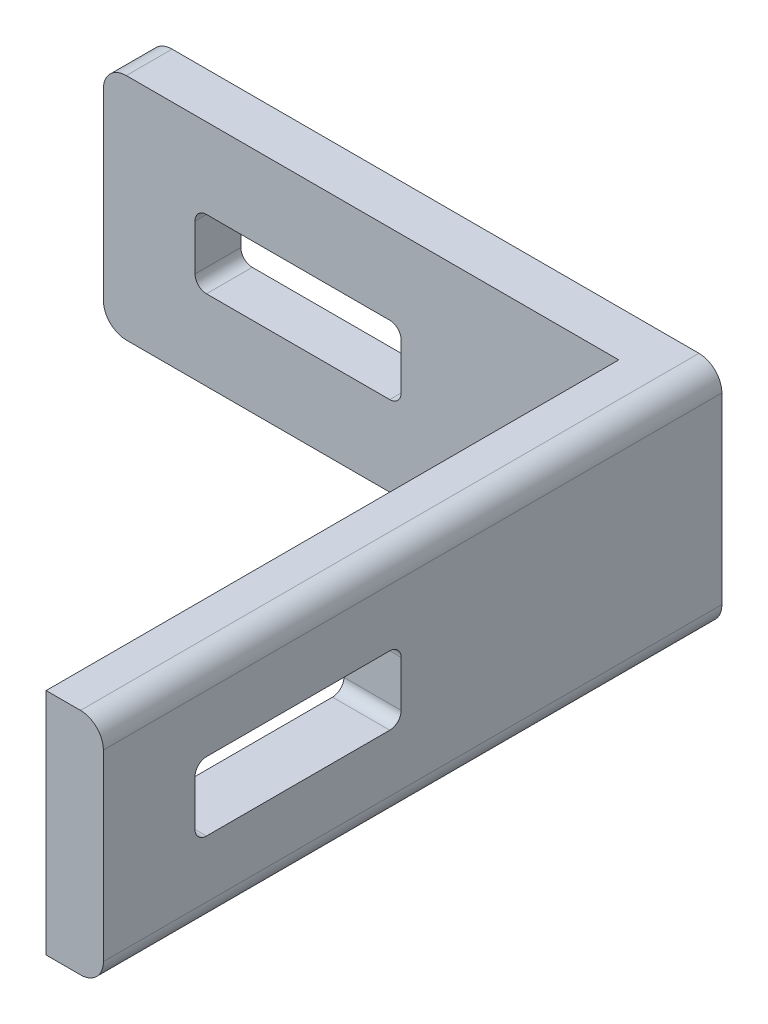
ISO-10303-21;
HEADER;
FILE_DESCRIPTION(('STEP AP214'),'2;1');
FILE_NAME('part.step','',(''),(''),'','','');
FILE_SCHEMA(('AUTOMOTIVE_DESIGN { 1 0 10303 214 1 1 1 1 }'));
ENDSEC;
DATA;
#1=APPLICATION_CONTEXT('core data for automotive mechanical design processes');
#2=APPLICATION_PROTOCOL_DEFINITION('international standard','automotive_design',2000,#1);
#3=PRODUCT_CONTEXT('',#1,'mechanical');
#4=PRODUCT('Part','Part','',(#3));
#5=PRODUCT_RELATED_PRODUCT_CATEGORY('part','',(#4));
#6=PRODUCT_DEFINITION_FORMATION('','',#4);
#7=PRODUCT_DEFINITION_CONTEXT('part definition',#1,'design');
#8=PRODUCT_DEFINITION('design','',#6,#7);
#9=PRODUCT_DEFINITION_SHAPE('','',#8);
#10=(LENGTH_UNIT() NAMED_UNIT(*) SI_UNIT(.MILLI.,.METRE.));
#11=(NAMED_UNIT(*) PLANE_ANGLE_UNIT() SI_UNIT($,.RADIAN.));
#12=(NAMED_UNIT(*) SI_UNIT($,.STERADIAN.) SOLID_ANGLE_UNIT());
#13=UNCERTAINTY_MEASURE_WITH_UNIT(LENGTH_MEASURE(1.E-05),#10,'distance_accuracy_value','');
#14=(GEOMETRIC_REPRESENTATION_CONTEXT(3) GLOBAL_UNCERTAINTY_ASSIGNED_CONTEXT((#13)) GLOBAL_UNIT_ASSIGNED_CONTEXT((#10,
#11,#12)) REPRESENTATION_CONTEXT('',''));
#15=CARTESIAN_POINT('',(0.,0.,0.));
#16=DIRECTION('',(0.,0.,1.));
#17=DIRECTION('',(1.,0.,0.));
#18=AXIS2_PLACEMENT_3D('',#15,#16,#17);
#19=CARTESIAN_POINT('',(34.7267267267267,6.70870870870871,4.));
#20=DIRECTION('',(0.,0.,-1.));
#21=DIRECTION('',(-1.,0.,0.));
#22=AXIS2_PLACEMENT_3D('',#19,#20,#21);
#23=PLANE('',#22);
#24=DIRECTION('',(0.,-1.,0.));
#25=VECTOR('',#24,1.);
#26=CARTESIAN_POINT('',(-5.27327327327327,0.708708708708703,4.));
#27=LINE('',#26,#25);
#28=CARTESIAN_POINT('',(-5.27327327327327,0.708708708708703,4.));
#29=VERTEX_POINT('',#28);
#30=CARTESIAN_POINT('',(-5.27327327327327,-3.29129129129128,4.));
#31=VERTEX_POINT('',#30);
#32=EDGE_CURVE('E279',#29,#31,#27,.T.);
#33=ORIENTED_EDGE('',*,*,#32,.F.);
#34=CARTESIAN_POINT('',(-4.27327327327327,0.708708708708711,4.));
#35=DIRECTION('',(0.,0.,1.));
#36=DIRECTION('',(-1.,0.,0.));
#37=AXIS2_PLACEMENT_3D('',#34,#35,#36);
#38=CIRCLE('',#37,1.);
#39=CARTESIAN_POINT('',(-4.27327327327327,1.70870870870871,4.));
#40=VERTEX_POINT('',#39);
#41=EDGE_CURVE('E277',#40,#29,#38,.T.);
#42=ORIENTED_EDGE('',*,*,#41,.F.);
#43=DIRECTION('',(-1.,0.,0.));
#44=VECTOR('',#43,1.);
#45=CARTESIAN_POINT('',(-4.27327327327327,1.70870870870871,4.));
#46=LINE('',#45,#44);
#47=CARTESIAN_POINT('',(11.7267267267267,1.70870870870871,4.));
#48=VERTEX_POINT('',#47);
#49=EDGE_CURVE('E297',#48,#40,#46,.T.);
#50=ORIENTED_EDGE('',*,*,#49,.F.);
#51=CARTESIAN_POINT('',(11.7267267267267,0.708708708708711,4.));
#52=DIRECTION('',(0.,0.,1.));
#53=DIRECTION('',(1.,0.,0.));
#54=AXIS2_PLACEMENT_3D('',#51,#52,#53);
#55=CIRCLE('',#54,1.);
#56=CARTESIAN_POINT('',(12.7267267267267,0.708708708708703,4.));
#57=VERTEX_POINT('',#56);
#58=EDGE_CURVE('E294',#57,#48,#55,.T.);
#59=ORIENTED_EDGE('',*,*,#58,.F.);
#60=DIRECTION('',(0.,1.,0.));
#61=VECTOR('',#60,1.);
#62=CARTESIAN_POINT('',(12.7267267267267,0.708708708708703,4.));
#63=LINE('',#62,#61);
#64=CARTESIAN_POINT('',(12.7267267267267,-3.29129129129129,4.));
#65=VERTEX_POINT('',#64);
#66=EDGE_CURVE('E291',#65,#57,#63,.T.);
#67=ORIENTED_EDGE('',*,*,#66,.F.);
#68=CARTESIAN_POINT('',(11.7267267267267,-3.29129129129129,4.));
#69=DIRECTION('',(0.,0.,1.));
#70=DIRECTION('',(1.,0.,0.));
#71=AXIS2_PLACEMENT_3D('',#68,#69,#70);
#72=CIRCLE('',#71,1.);
#73=CARTESIAN_POINT('',(11.7267267267267,-4.29129129129129,4.));
#74=VERTEX_POINT('',#73);
#75=EDGE_CURVE('E288',#74,#65,#72,.T.);
#76=ORIENTED_EDGE('',*,*,#75,.F.);
#77=DIRECTION('',(1.,0.,0.));
#78=VECTOR('',#77,1.);
#79=CARTESIAN_POINT('',(-4.27327327327327,-4.29129129129129,4.));
#80=LINE('',#79,#78);
#81=CARTESIAN_POINT('',(-4.27327327327327,-4.29129129129129,4.));
#82=VERTEX_POINT('',#81);
#83=EDGE_CURVE('E285',#82,#74,#80,.T.);
#84=ORIENTED_EDGE('',*,*,#83,.F.);
#85=CARTESIAN_POINT('',(-4.27327327327327,-3.29129129129129,4.));
#86=DIRECTION('',(0.,0.,1.));
#87=DIRECTION('',(1.,0.,0.));
#88=AXIS2_PLACEMENT_3D('',#85,#86,#87);
#89=CIRCLE('',#88,1.);
#90=EDGE_CURVE('E282',#31,#82,#89,.T.);
#91=ORIENTED_EDGE('',*,*,#90,.F.);
#92=EDGE_LOOP('',(#33,#42,#50,#59,#67,#76,#84,#91));
#93=FACE_BOUND('',#92,.T.);
#94=DIRECTION('',(0.,-1.,0.));
#95=VECTOR('',#94,1.);
#96=CARTESIAN_POINT('',(31.7267267267267,8.70870870870871,4.));
#97=LINE('',#96,#95);
#98=CARTESIAN_POINT('',(31.7267267267267,8.70870870870871,4.));
#99=VERTEX_POINT('',#98);
#100=CARTESIAN_POINT('',(31.7267267267267,-11.2912912912913,4.));
#101=VERTEX_POINT('',#100);
#102=EDGE_CURVE('E303',#99,#101,#97,.T.);
#103=ORIENTED_EDGE('',*,*,#102,.F.);
#104=DIRECTION('',(-1.,0.,0.));
#105=VECTOR('',#104,1.);
#106=CARTESIAN_POINT('',(-11.2732732732733,8.70870870870871,4.));
#107=LINE('',#106,#105);
#108=CARTESIAN_POINT('',(-11.2732732732733,8.70870870870871,4.));
#109=VERTEX_POINT('',#108);
#110=EDGE_CURVE('E344',#99,#109,#107,.T.);
#111=ORIENTED_EDGE('',*,*,#110,.T.);
#112=CARTESIAN_POINT('',(-11.2732732732733,6.70870870870871,4.));
#113=DIRECTION('',(0.,0.,1.));
#114=DIRECTION('',(-1.,0.,0.));
#115=AXIS2_PLACEMENT_3D('',#112,#113,#114);
#116=CIRCLE('',#115,2.);
#117=CARTESIAN_POINT('',(-13.2732732732733,6.7087087087087,4.));
#118=VERTEX_POINT('',#117);
#119=EDGE_CURVE('E346',#109,#118,#116,.T.);
#120=ORIENTED_EDGE('',*,*,#119,.T.);
#121=DIRECTION('',(0.,-1.,0.));
#122=VECTOR('',#121,1.);
#123=CARTESIAN_POINT('',(-13.2732732732733,6.7087087087087,4.));
#124=LINE('',#123,#122);
#125=CARTESIAN_POINT('',(-13.2732732732733,-9.29129129129128,4.));
#126=VERTEX_POINT('',#125);
#127=EDGE_CURVE('E349',#118,#126,#124,.T.);
#128=ORIENTED_EDGE('',*,*,#127,.T.);
#129=CARTESIAN_POINT('',(-11.2732732732733,-9.29129129129129,4.));
#130=DIRECTION('',(0.,0.,1.));
#131=DIRECTION('',(-1.,0.,0.));
#132=AXIS2_PLACEMENT_3D('',#129,#130,#131);
#133=CIRCLE('',#132,2.);
#134=CARTESIAN_POINT('',(-11.2732732732733,-11.2912912912913,4.));
#135=VERTEX_POINT('',#134);
#136=EDGE_CURVE('E351',#126,#135,#133,.T.);
#137=ORIENTED_EDGE('',*,*,#136,.T.);
#138=DIRECTION('',(1.,0.,0.));
#139=VECTOR('',#138,1.);
#140=CARTESIAN_POINT('',(-11.2732732732733,-11.2912912912913,4.));
#141=LINE('',#140,#139);
#142=EDGE_CURVE('E353',#135,#101,#141,.T.);
#143=ORIENTED_EDGE('',*,*,#142,.T.);
#144=EDGE_LOOP('',(#103,#111,#120,#128,#137,#143));
#145=FACE_BOUND('',#144,.T.);
#146=ADVANCED_FACE('F35',(#93,#145),#23,.F.);
#147=CARTESIAN_POINT('',(34.7267267267267,6.70870870870871,4.));
#148=DIRECTION('',(0.,0.,-1.));
#149=DIRECTION('',(-1.,0.,0.));
#150=AXIS2_PLACEMENT_3D('',#147,#148,#149);
#151=CYLINDRICAL_SURFACE('',#150,2.);
#152=CARTESIAN_POINT('',(34.7267267267267,6.70870870870871,0.));
#153=DIRECTION('',(0.,0.,1.));
#154=DIRECTION('',(-1.,0.,0.));
#155=AXIS2_PLACEMENT_3D('',#152,#153,#154);
#156=CIRCLE('',#155,2.);
#157=CARTESIAN_POINT('',(36.7267267267267,6.70870870870871,0.));
#158=VERTEX_POINT('',#157);
#159=CARTESIAN_POINT('',(34.7267267267267,8.70870870870871,0.));
#160=VERTEX_POINT('',#159);
#161=EDGE_CURVE('E343',#158,#160,#156,.T.);
#162=ORIENTED_EDGE('',*,*,#161,.T.);
#163=DIRECTION('',(0.,0.,-1.));
#164=VECTOR('',#163,1.);
#165=CARTESIAN_POINT('',(34.7267267267267,8.70870870870871,4.));
#166=LINE('',#165,#164);
#167=CARTESIAN_POINT('',(34.7267267267267,8.70870870870871,54.));
#168=VERTEX_POINT('',#167);
#169=EDGE_CURVE('E391',#168,#160,#166,.T.);
#170=ORIENTED_EDGE('',*,*,#169,.F.);
#171=CARTESIAN_POINT('',(34.7267267267267,6.70870870870871,54.));
#172=DIRECTION('',(0.,0.,1.));
#173=DIRECTION('',(-1.,0.,0.));
#174=AXIS2_PLACEMENT_3D('',#171,#172,#173);
#175=CIRCLE('',#174,2.);
#176=CARTESIAN_POINT('',(36.7267267267267,6.7087087087087,54.));
#177=VERTEX_POINT('',#176);
#178=EDGE_CURVE('E330',#177,#168,#175,.T.);
#179=ORIENTED_EDGE('',*,*,#178,.F.);
#180=DIRECTION('',(0.,0.,-1.));
#181=VECTOR('',#180,1.);
#182=CARTESIAN_POINT('',(36.7267267267267,6.70870870870871,4.));
#183=LINE('',#182,#181);
#184=EDGE_CURVE('E355',#177,#158,#183,.T.);
#185=ORIENTED_EDGE('',*,*,#184,.T.);
#186=EDGE_LOOP('',(#162,#170,#179,#185));
#187=FACE_BOUND('',#186,.T.);
#188=ADVANCED_FACE('F37',(#187),#151,.T.);
#189=CARTESIAN_POINT('',(-11.2732732732733,8.70870870870871,4.));
#190=DIRECTION('',(0.,-1.,0.));
#191=DIRECTION('',(0.,0.,-1.));
#192=AXIS2_PLACEMENT_3D('',#189,#190,#191);
#193=PLANE('',#192);
#194=DIRECTION('',(-1.,0.,0.));
#195=VECTOR('',#194,1.);
#196=CARTESIAN_POINT('',(-11.2732732732733,8.70870870870871,0.));
#197=LINE('',#196,#195);
#198=CARTESIAN_POINT('',(-11.2732732732733,8.70870870870871,0.));
#199=VERTEX_POINT('',#198);
#200=EDGE_CURVE('E358',#160,#199,#197,.T.);
#201=ORIENTED_EDGE('',*,*,#200,.T.);
#202=DIRECTION('',(0.,0.,-1.));
#203=VECTOR('',#202,1.);
#204=CARTESIAN_POINT('',(-11.2732732732733,8.70870870870871,4.));
#205=LINE('',#204,#203);
#206=EDGE_CURVE('E388',#109,#199,#205,.T.);
#207=ORIENTED_EDGE('',*,*,#206,.F.);
#208=ORIENTED_EDGE('',*,*,#110,.F.);
#209=DIRECTION('',(0.,0.,-1.));
#210=VECTOR('',#209,1.);
#211=CARTESIAN_POINT('',(31.7267267267267,8.70870870870871,54.));
#212=LINE('',#211,#210);
#213=CARTESIAN_POINT('',(31.7267267267267,8.70870870870871,54.));
#214=VERTEX_POINT('',#213);
#215=EDGE_CURVE('E335',#214,#99,#212,.T.);
#216=ORIENTED_EDGE('',*,*,#215,.F.);
#217=DIRECTION('',(-1.,0.,0.));
#218=VECTOR('',#217,1.);
#219=CARTESIAN_POINT('',(31.7267267267267,8.70870870870871,54.));
#220=LINE('',#219,#218);
#221=EDGE_CURVE('E333',#168,#214,#220,.T.);
#222=ORIENTED_EDGE('',*,*,#221,.F.);
#223=ORIENTED_EDGE('',*,*,#169,.T.);
#224=EDGE_LOOP('',(#201,#207,#208,#216,#222,#223));
#225=FACE_BOUND('',#224,.T.);
#226=ADVANCED_FACE('F463',(#225),#193,.F.);
#227=CARTESIAN_POINT('',(-11.2732732732733,6.70870870870871,4.));
#228=DIRECTION('',(0.,0.,-1.));
#229=DIRECTION('',(-1.,0.,0.));
#230=AXIS2_PLACEMENT_3D('',#227,#228,#229);
#231=CYLINDRICAL_SURFACE('',#230,2.);
#232=CARTESIAN_POINT('',(-11.2732732732733,6.70870870870871,0.));
#233=DIRECTION('',(0.,0.,1.));
#234=DIRECTION('',(-1.,0.,0.));
#235=AXIS2_PLACEMENT_3D('',#232,#233,#234);
#236=CIRCLE('',#235,2.);
#237=CARTESIAN_POINT('',(-13.2732732732733,6.7087087087087,0.));
#238=VERTEX_POINT('',#237);
#239=EDGE_CURVE('E360',#199,#238,#236,.T.);
#240=ORIENTED_EDGE('',*,*,#239,.T.);
#241=DIRECTION('',(0.,0.,-1.));
#242=VECTOR('',#241,1.);
#243=CARTESIAN_POINT('',(-13.2732732732733,6.7087087087087,4.));
#244=LINE('',#243,#242);
#245=EDGE_CURVE('E385',#118,#238,#244,.T.);
#246=ORIENTED_EDGE('',*,*,#245,.F.);
#247=ORIENTED_EDGE('',*,*,#119,.F.);
#248=ORIENTED_EDGE('',*,*,#206,.T.);
#249=EDGE_LOOP('',(#240,#246,#247,#248));
#250=FACE_BOUND('',#249,.T.);
#251=ADVANCED_FACE('F489',(#250),#231,.T.);
#252=CARTESIAN_POINT('',(-13.2732732732733,6.7087087087087,4.));
#253=DIRECTION('',(1.,0.,0.));
#254=DIRECTION('',(0.,0.,-1.));
#255=AXIS2_PLACEMENT_3D('',#252,#253,#254);
#256=PLANE('',#255);
#257=DIRECTION('',(0.,-1.,0.));
#258=VECTOR('',#257,1.);
#259=CARTESIAN_POINT('',(-13.2732732732733,6.7087087087087,0.));
#260=LINE('',#259,#258);
#261=CARTESIAN_POINT('',(-13.2732732732733,-9.29129129129128,0.));
#262=VERTEX_POINT('',#261);
#263=EDGE_CURVE('E362',#238,#262,#260,.T.);
#264=ORIENTED_EDGE('',*,*,#263,.T.);
#265=DIRECTION('',(0.,0.,-1.));
#266=VECTOR('',#265,1.);
#267=CARTESIAN_POINT('',(-13.2732732732733,-9.29129129129128,4.));
#268=LINE('',#267,#266);
#269=EDGE_CURVE('E382',#126,#262,#268,.T.);
#270=ORIENTED_EDGE('',*,*,#269,.F.);
#271=ORIENTED_EDGE('',*,*,#127,.F.);
#272=ORIENTED_EDGE('',*,*,#245,.T.);
#273=EDGE_LOOP('',(#264,#270,#271,#272));
#274=FACE_BOUND('',#273,.T.);
#275=ADVANCED_FACE('F485',(#274),#256,.F.);
#276=CARTESIAN_POINT('',(-11.2732732732733,-9.29129129129129,4.));
#277=DIRECTION('',(0.,0.,-1.));
#278=DIRECTION('',(-1.,0.,0.));
#279=AXIS2_PLACEMENT_3D('',#276,#277,#278);
#280=CYLINDRICAL_SURFACE('',#279,2.);
#281=CARTESIAN_POINT('',(-11.2732732732733,-9.29129129129129,0.));
#282=DIRECTION('',(0.,0.,1.));
#283=DIRECTION('',(-1.,0.,0.));
#284=AXIS2_PLACEMENT_3D('',#281,#282,#283);
#285=CIRCLE('',#284,2.);
#286=CARTESIAN_POINT('',(-11.2732732732733,-11.2912912912913,0.));
#287=VERTEX_POINT('',#286);
#288=EDGE_CURVE('E364',#262,#287,#285,.T.);
#289=ORIENTED_EDGE('',*,*,#288,.T.);
#290=DIRECTION('',(0.,0.,-1.));
#291=VECTOR('',#290,1.);
#292=CARTESIAN_POINT('',(-11.2732732732733,-11.2912912912913,4.));
#293=LINE('',#292,#291);
#294=EDGE_CURVE('E379',#135,#287,#293,.T.);
#295=ORIENTED_EDGE('',*,*,#294,.F.);
#296=ORIENTED_EDGE('',*,*,#136,.F.);
#297=ORIENTED_EDGE('',*,*,#269,.T.);
#298=EDGE_LOOP('',(#289,#295,#296,#297));
#299=FACE_BOUND('',#298,.T.);
#300=ADVANCED_FACE('F481',(#299),#280,.T.);
#301=CARTESIAN_POINT('',(-11.2732732732733,-11.2912912912913,4.));
#302=DIRECTION('',(0.,1.,0.));
#303=DIRECTION('',(0.,0.,1.));
#304=AXIS2_PLACEMENT_3D('',#301,#302,#303);
#305=PLANE('',#304);
#306=DIRECTION('',(1.,0.,0.));
#307=VECTOR('',#306,1.);
#308=CARTESIAN_POINT('',(-11.2732732732733,-11.2912912912913,0.));
#309=LINE('',#308,#307);
#310=CARTESIAN_POINT('',(34.7267267267267,-11.2912912912913,0.));
#311=VERTEX_POINT('',#310);
#312=EDGE_CURVE('E366',#287,#311,#309,.T.);
#313=ORIENTED_EDGE('',*,*,#312,.T.);
#314=DIRECTION('',(0.,0.,-1.));
#315=VECTOR('',#314,1.);
#316=CARTESIAN_POINT('',(34.7267267267267,-11.2912912912913,4.));
#317=LINE('',#316,#315);
#318=CARTESIAN_POINT('',(34.7267267267267,-11.2912912912913,54.));
#319=VERTEX_POINT('',#318);
#320=EDGE_CURVE('E376',#319,#311,#317,.T.);
#321=ORIENTED_EDGE('',*,*,#320,.F.);
#322=DIRECTION('',(1.,0.,0.));
#323=VECTOR('',#322,1.);
#324=CARTESIAN_POINT('',(31.7267267267267,-11.2912912912913,54.));
#325=LINE('',#324,#323);
#326=CARTESIAN_POINT('',(31.7267267267267,-11.2912912912913,54.));
#327=VERTEX_POINT('',#326);
#328=EDGE_CURVE('E321',#327,#319,#325,.T.);
#329=ORIENTED_EDGE('',*,*,#328,.F.);
#330=DIRECTION('',(0.,0.,-1.));
#331=VECTOR('',#330,1.);
#332=CARTESIAN_POINT('',(31.7267267267267,-11.2912912912913,54.));
#333=LINE('',#332,#331);
#334=EDGE_CURVE('E340',#327,#101,#333,.T.);
#335=ORIENTED_EDGE('',*,*,#334,.T.);
#336=ORIENTED_EDGE('',*,*,#142,.F.);
#337=ORIENTED_EDGE('',*,*,#294,.T.);
#338=EDGE_LOOP('',(#313,#321,#329,#335,#336,#337));
#339=FACE_BOUND('',#338,.T.);
#340=ADVANCED_FACE('F477',(#339),#305,.F.);
#341=CARTESIAN_POINT('',(34.7267267267267,-9.29129129129129,4.));
#342=DIRECTION('',(0.,0.,-1.));
#343=DIRECTION('',(-1.,0.,0.));
#344=AXIS2_PLACEMENT_3D('',#341,#342,#343);
#345=CYLINDRICAL_SURFACE('',#344,2.);
#346=CARTESIAN_POINT('',(34.7267267267267,-9.29129129129129,0.));
#347=DIRECTION('',(0.,0.,1.));
#348=DIRECTION('',(-1.,0.,0.));
#349=AXIS2_PLACEMENT_3D('',#346,#347,#348);
#350=CIRCLE('',#349,2.);
#351=CARTESIAN_POINT('',(36.7267267267267,-9.29129129129129,0.));
#352=VERTEX_POINT('',#351);
#353=EDGE_CURVE('E368',#311,#352,#350,.T.);
#354=ORIENTED_EDGE('',*,*,#353,.T.);
#355=DIRECTION('',(0.,0.,-1.));
#356=VECTOR('',#355,1.);
#357=CARTESIAN_POINT('',(36.7267267267267,-9.29129129129129,4.));
#358=LINE('',#357,#356);
#359=CARTESIAN_POINT('',(36.7267267267267,-9.29129129129128,54.));
#360=VERTEX_POINT('',#359);
#361=EDGE_CURVE('E373',#360,#352,#358,.T.);
#362=ORIENTED_EDGE('',*,*,#361,.F.);
#363=CARTESIAN_POINT('',(34.7267267267267,-9.29129129129129,54.));
#364=DIRECTION('',(0.,0.,1.));
#365=DIRECTION('',(-1.,0.,0.));
#366=AXIS2_PLACEMENT_3D('',#363,#364,#365);
#367=CIRCLE('',#366,2.);
#368=EDGE_CURVE('E324',#319,#360,#367,.T.);
#369=ORIENTED_EDGE('',*,*,#368,.F.);
#370=ORIENTED_EDGE('',*,*,#320,.T.);
#371=EDGE_LOOP('',(#354,#362,#369,#370));
#372=FACE_BOUND('',#371,.T.);
#373=ADVANCED_FACE('F473',(#372),#345,.T.);
#374=CARTESIAN_POINT('',(36.7267267267267,6.70870870870871,4.));
#375=DIRECTION('',(-1.,0.,0.));
#376=DIRECTION('',(0.,0.,1.));
#377=AXIS2_PLACEMENT_3D('',#374,#375,#376);
#378=PLANE('',#377);
#379=DIRECTION('',(0.,0.,-1.));
#380=VECTOR('',#379,1.);
#381=CARTESIAN_POINT('',(36.7267267267267,1.70870870870871,4.));
#382=LINE('',#381,#380);
#383=CARTESIAN_POINT('',(36.7267267267267,1.70870870870871,45.));
#384=VERTEX_POINT('',#383);
#385=CARTESIAN_POINT('',(36.7267267267267,1.70870870870871,29.));
#386=VERTEX_POINT('',#385);
#387=EDGE_CURVE('E271',#384,#386,#382,.T.);
#388=ORIENTED_EDGE('',*,*,#387,.T.);
#389=CARTESIAN_POINT('',(36.7267267267267,0.70870870870871,29.));
#390=DIRECTION('',(-1.,0.,0.));
#391=DIRECTION('',(0.,0.,1.));
#392=AXIS2_PLACEMENT_3D('',#389,#390,#391);
#393=CIRCLE('',#392,1.);
#394=CARTESIAN_POINT('',(36.7267267267267,0.70870870870871,28.));
#395=VERTEX_POINT('',#394);
#396=EDGE_CURVE('E274',#386,#395,#393,.T.);
#397=ORIENTED_EDGE('',*,*,#396,.T.);
#398=DIRECTION('',(0.,-1.,0.));
#399=VECTOR('',#398,1.);
#400=CARTESIAN_POINT('',(36.7267267267267,6.70870870870871,28.));
#401=LINE('',#400,#399);
#402=CARTESIAN_POINT('',(36.7267267267267,-3.29129129129129,28.));
#403=VERTEX_POINT('',#402);
#404=EDGE_CURVE('E246',#395,#403,#401,.T.);
#405=ORIENTED_EDGE('',*,*,#404,.T.);
#406=CARTESIAN_POINT('',(36.7267267267267,-3.29129129129129,29.));
#407=DIRECTION('',(-1.,0.,0.));
#408=DIRECTION('',(0.,0.,1.));
#409=AXIS2_PLACEMENT_3D('',#406,#407,#408);
#410=CIRCLE('',#409,1.);
#411=CARTESIAN_POINT('',(36.7267267267267,-4.29129129129129,29.));
#412=VERTEX_POINT('',#411);
#413=EDGE_CURVE('E213',#403,#412,#410,.T.);
#414=ORIENTED_EDGE('',*,*,#413,.T.);
#415=DIRECTION('',(0.,0.,1.));
#416=VECTOR('',#415,1.);
#417=CARTESIAN_POINT('',(36.7267267267267,-4.29129129129129,4.));
#418=LINE('',#417,#416);
#419=CARTESIAN_POINT('',(36.7267267267267,-4.29129129129129,45.));
#420=VERTEX_POINT('',#419);
#421=EDGE_CURVE('E259',#412,#420,#418,.T.);
#422=ORIENTED_EDGE('',*,*,#421,.T.);
#423=CARTESIAN_POINT('',(36.7267267267267,-3.29129129129129,45.));
#424=DIRECTION('',(-1.,0.,0.));
#425=DIRECTION('',(0.,0.,1.));
#426=AXIS2_PLACEMENT_3D('',#423,#424,#425);
#427=CIRCLE('',#426,1.);
#428=CARTESIAN_POINT('',(36.7267267267267,-3.29129129129129,46.));
#429=VERTEX_POINT('',#428);
#430=EDGE_CURVE('E262',#420,#429,#427,.T.);
#431=ORIENTED_EDGE('',*,*,#430,.T.);
#432=DIRECTION('',(0.,1.,0.));
#433=VECTOR('',#432,1.);
#434=CARTESIAN_POINT('',(36.7267267267267,6.70870870870871,46.));
#435=LINE('',#434,#433);
#436=CARTESIAN_POINT('',(36.7267267267267,0.70870870870871,46.));
#437=VERTEX_POINT('',#436);
#438=EDGE_CURVE('E265',#429,#437,#435,.T.);
#439=ORIENTED_EDGE('',*,*,#438,.T.);
#440=CARTESIAN_POINT('',(36.7267267267267,0.70870870870871,45.));
#441=DIRECTION('',(-1.,0.,0.));
#442=DIRECTION('',(0.,0.,1.));
#443=AXIS2_PLACEMENT_3D('',#440,#441,#442);
#444=CIRCLE('',#443,1.);
#445=EDGE_CURVE('E268',#437,#384,#444,.T.);
#446=ORIENTED_EDGE('',*,*,#445,.T.);
#447=EDGE_LOOP('',(#388,#397,#405,#414,#422,#431,#439,#446));
#448=FACE_BOUND('',#447,.T.);
#449=DIRECTION('',(0.,1.,0.));
#450=VECTOR('',#449,1.);
#451=CARTESIAN_POINT('',(36.7267267267267,6.70870870870871,0.));
#452=LINE('',#451,#450);
#453=EDGE_CURVE('E347',#352,#158,#452,.T.);
#454=ORIENTED_EDGE('',*,*,#453,.T.);
#455=ORIENTED_EDGE('',*,*,#184,.F.);
#456=DIRECTION('',(0.,1.,0.));
#457=VECTOR('',#456,1.);
#458=CARTESIAN_POINT('',(36.7267267267267,6.70870870870869,54.));
#459=LINE('',#458,#457);
#460=EDGE_CURVE('E327',#360,#177,#459,.T.);
#461=ORIENTED_EDGE('',*,*,#460,.F.);
#462=ORIENTED_EDGE('',*,*,#361,.T.);
#463=EDGE_LOOP('',(#454,#455,#461,#462));
#464=FACE_BOUND('',#463,.T.);
#465=ADVANCED_FACE('F470',(#448,#464),#378,.F.);
#466=CARTESIAN_POINT('',(34.7267267267267,6.70870870870871,0.));
#467=DIRECTION('',(0.,0.,-1.));
#468=DIRECTION('',(-1.,0.,0.));
#469=AXIS2_PLACEMENT_3D('',#466,#467,#468);
#470=PLANE('',#469);
#471=CARTESIAN_POINT('',(-4.27327327327327,0.708708708708711,0.));
#472=DIRECTION('',(0.,0.,-1.));
#473=DIRECTION('',(-1.,0.,0.));
#474=AXIS2_PLACEMENT_3D('',#471,#472,#473);
#475=CIRCLE('',#474,1.);
#476=CARTESIAN_POINT('',(-5.27327327327327,0.708708708708703,0.));
#477=VERTEX_POINT('',#476);
#478=CARTESIAN_POINT('',(-4.27327327327327,1.70870870870871,0.));
#479=VERTEX_POINT('',#478);
#480=EDGE_CURVE('E11',#477,#479,#475,.T.);
#481=ORIENTED_EDGE('',*,*,#480,.F.);
#482=DIRECTION('',(0.,1.,0.));
#483=VECTOR('',#482,1.);
#484=CARTESIAN_POINT('',(-5.27327327327327,6.70870870870871,0.));
#485=LINE('',#484,#483);
#486=CARTESIAN_POINT('',(-5.27327327327327,-3.29129129129128,0.));
#487=VERTEX_POINT('',#486);
#488=EDGE_CURVE('E394',#487,#477,#485,.T.);
#489=ORIENTED_EDGE('',*,*,#488,.F.);
#490=CARTESIAN_POINT('',(-4.27327327327327,-3.29129129129129,0.));
#491=DIRECTION('',(0.,0.,-1.));
#492=DIRECTION('',(-1.,0.,0.));
#493=AXIS2_PLACEMENT_3D('',#490,#491,#492);
#494=CIRCLE('',#493,1.);
#495=CARTESIAN_POINT('',(-4.27327327327327,-4.29129129129129,0.));
#496=VERTEX_POINT('',#495);
#497=EDGE_CURVE('E396',#496,#487,#494,.T.);
#498=ORIENTED_EDGE('',*,*,#497,.F.);
#499=DIRECTION('',(-1.,0.,0.));
#500=VECTOR('',#499,1.);
#501=CARTESIAN_POINT('',(34.7267267267267,-4.29129129129129,0.));
#502=LINE('',#501,#500);
#503=CARTESIAN_POINT('',(11.7267267267267,-4.29129129129129,0.));
#504=VERTEX_POINT('',#503);
#505=EDGE_CURVE('E399',#504,#496,#502,.T.);
#506=ORIENTED_EDGE('',*,*,#505,.F.);
#507=CARTESIAN_POINT('',(11.7267267267267,-3.29129129129129,0.));
#508=DIRECTION('',(0.,0.,-1.));
#509=DIRECTION('',(-1.,0.,0.));
#510=AXIS2_PLACEMENT_3D('',#507,#508,#509);
#511=CIRCLE('',#510,1.);
#512=CARTESIAN_POINT('',(12.7267267267267,-3.29129129129129,0.));
#513=VERTEX_POINT('',#512);
#514=EDGE_CURVE('E401',#513,#504,#511,.T.);
#515=ORIENTED_EDGE('',*,*,#514,.F.);
#516=DIRECTION('',(0.,-1.,0.));
#517=VECTOR('',#516,1.);
#518=CARTESIAN_POINT('',(12.7267267267267,6.70870870870871,0.));
#519=LINE('',#518,#517);
#520=CARTESIAN_POINT('',(12.7267267267267,0.708708708708703,0.));
#521=VERTEX_POINT('',#520);
#522=EDGE_CURVE('E403',#521,#513,#519,.T.);
#523=ORIENTED_EDGE('',*,*,#522,.F.);
#524=CARTESIAN_POINT('',(11.7267267267267,0.708708708708711,0.));
#525=DIRECTION('',(0.,0.,-1.));
#526=DIRECTION('',(-1.,0.,0.));
#527=AXIS2_PLACEMENT_3D('',#524,#525,#526);
#528=CIRCLE('',#527,1.);
#529=CARTESIAN_POINT('',(11.7267267267267,1.70870870870871,0.));
#530=VERTEX_POINT('',#529);
#531=EDGE_CURVE('E405',#530,#521,#528,.T.);
#532=ORIENTED_EDGE('',*,*,#531,.F.);
#533=DIRECTION('',(1.,0.,0.));
#534=VECTOR('',#533,1.);
#535=CARTESIAN_POINT('',(34.7267267267267,1.70870870870871,0.));
#536=LINE('',#535,#534);
#537=EDGE_CURVE('E43',#479,#530,#536,.T.);
#538=ORIENTED_EDGE('',*,*,#537,.F.);
#539=EDGE_LOOP('',(#481,#489,#498,#506,#515,#523,#532,#538));
#540=FACE_BOUND('',#539,.T.);
#541=ORIENTED_EDGE('',*,*,#161,.F.);
#542=ORIENTED_EDGE('',*,*,#453,.F.);
#543=ORIENTED_EDGE('',*,*,#353,.F.);
#544=ORIENTED_EDGE('',*,*,#312,.F.);
#545=ORIENTED_EDGE('',*,*,#288,.F.);
#546=ORIENTED_EDGE('',*,*,#263,.F.);
#547=ORIENTED_EDGE('',*,*,#239,.F.);
#548=ORIENTED_EDGE('',*,*,#200,.F.);
#549=EDGE_LOOP('',(#541,#542,#543,#544,#545,#546,#547,#548));
#550=FACE_BOUND('',#549,.T.);
#551=ADVANCED_FACE('F420',(#540,#550),#470,.T.);
#552=CARTESIAN_POINT('',(31.7267267267267,8.70870870870871,54.));
#553=DIRECTION('',(1.,0.,0.));
#554=DIRECTION('',(0.,0.,-1.));
#555=AXIS2_PLACEMENT_3D('',#552,#553,#554);
#556=PLANE('',#555);
#557=DIRECTION('',(0.,-1.,0.));
#558=VECTOR('',#557,1.);
#559=CARTESIAN_POINT('',(31.7267267267267,0.70870870870871,28.));
#560=LINE('',#559,#558);
#561=CARTESIAN_POINT('',(31.7267267267267,0.70870870870871,28.));
#562=VERTEX_POINT('',#561);
#563=CARTESIAN_POINT('',(31.7267267267267,-3.29129129129129,28.));
#564=VERTEX_POINT('',#563);
#565=EDGE_CURVE('E219',#562,#564,#560,.T.);
#566=ORIENTED_EDGE('',*,*,#565,.F.);
#567=CARTESIAN_POINT('',(31.7267267267267,0.70870870870871,29.));
#568=DIRECTION('',(-1.,0.,0.));
#569=DIRECTION('',(0.,0.,-1.));
#570=AXIS2_PLACEMENT_3D('',#567,#568,#569);
#571=CIRCLE('',#570,1.);
#572=CARTESIAN_POINT('',(31.7267267267267,1.70870870870871,29.));
#573=VERTEX_POINT('',#572);
#574=EDGE_CURVE('E58',#573,#562,#571,.T.);
#575=ORIENTED_EDGE('',*,*,#574,.F.);
#576=DIRECTION('',(0.,0.,-1.));
#577=VECTOR('',#576,1.);
#578=CARTESIAN_POINT('',(31.7267267267267,1.70870870870871,29.));
#579=LINE('',#578,#577);
#580=CARTESIAN_POINT('',(31.7267267267267,1.70870870870871,45.));
#581=VERTEX_POINT('',#580);
#582=EDGE_CURVE('E241',#581,#573,#579,.T.);
#583=ORIENTED_EDGE('',*,*,#582,.F.);
#584=CARTESIAN_POINT('',(31.7267267267267,0.70870870870871,45.));
#585=DIRECTION('',(-1.,0.,0.));
#586=DIRECTION('',(0.,0.,1.));
#587=AXIS2_PLACEMENT_3D('',#584,#585,#586);
#588=CIRCLE('',#587,1.);
#589=CARTESIAN_POINT('',(31.7267267267267,0.70870870870871,46.));
#590=VERTEX_POINT('',#589);
#591=EDGE_CURVE('E238',#590,#581,#588,.T.);
#592=ORIENTED_EDGE('',*,*,#591,.F.);
#593=DIRECTION('',(0.,1.,0.));
#594=VECTOR('',#593,1.);
#595=CARTESIAN_POINT('',(31.7267267267267,0.70870870870871,46.));
#596=LINE('',#595,#594);
#597=CARTESIAN_POINT('',(31.7267267267267,-3.29129129129129,46.));
#598=VERTEX_POINT('',#597);
#599=EDGE_CURVE('E235',#598,#590,#596,.T.);
#600=ORIENTED_EDGE('',*,*,#599,.F.);
#601=CARTESIAN_POINT('',(31.7267267267267,-3.29129129129129,45.));
#602=DIRECTION('',(-1.,0.,0.));
#603=DIRECTION('',(0.,0.,1.));
#604=AXIS2_PLACEMENT_3D('',#601,#602,#603);
#605=CIRCLE('',#604,1.);
#606=CARTESIAN_POINT('',(31.7267267267267,-4.29129129129129,45.));
#607=VERTEX_POINT('',#606);
#608=EDGE_CURVE('E229',#607,#598,#605,.T.);
#609=ORIENTED_EDGE('',*,*,#608,.F.);
#610=DIRECTION('',(0.,0.,1.));
#611=VECTOR('',#610,1.);
#612=CARTESIAN_POINT('',(31.7267267267267,-4.29129129129129,29.));
#613=LINE('',#612,#611);
#614=CARTESIAN_POINT('',(31.7267267267267,-4.29129129129129,29.));
#615=VERTEX_POINT('',#614);
#616=EDGE_CURVE('E227',#615,#607,#613,.T.);
#617=ORIENTED_EDGE('',*,*,#616,.F.);
#618=CARTESIAN_POINT('',(31.7267267267267,-3.29129129129129,29.));
#619=DIRECTION('',(-1.,0.,0.));
#620=DIRECTION('',(0.,0.,1.));
#621=AXIS2_PLACEMENT_3D('',#618,#619,#620);
#622=CIRCLE('',#621,1.);
#623=EDGE_CURVE('E210',#564,#615,#622,.T.);
#624=ORIENTED_EDGE('',*,*,#623,.F.);
#625=EDGE_LOOP('',(#566,#575,#583,#592,#600,#609,#617,#624));
#626=FACE_BOUND('',#625,.T.);
#627=ORIENTED_EDGE('',*,*,#102,.T.);
#628=ORIENTED_EDGE('',*,*,#334,.F.);
#629=DIRECTION('',(0.,-1.,0.));
#630=VECTOR('',#629,1.);
#631=CARTESIAN_POINT('',(31.7267267267267,8.70870870870871,54.));
#632=LINE('',#631,#630);
#633=EDGE_CURVE('E318',#214,#327,#632,.T.);
#634=ORIENTED_EDGE('',*,*,#633,.F.);
#635=ORIENTED_EDGE('',*,*,#215,.T.);
#636=EDGE_LOOP('',(#627,#628,#634,#635));
#637=FACE_BOUND('',#636,.T.);
#638=ADVANCED_FACE('F223',(#626,#637),#556,.F.);
#639=CARTESIAN_POINT('',(34.7267267267267,-9.29129129129129,54.));
#640=DIRECTION('',(0.,0.,-1.));
#641=DIRECTION('',(-1.,0.,0.));
#642=AXIS2_PLACEMENT_3D('',#639,#640,#641);
#643=PLANE('',#642);
#644=ORIENTED_EDGE('',*,*,#633,.T.);
#645=ORIENTED_EDGE('',*,*,#328,.T.);
#646=ORIENTED_EDGE('',*,*,#368,.T.);
#647=ORIENTED_EDGE('',*,*,#460,.T.);
#648=ORIENTED_EDGE('',*,*,#178,.T.);
#649=ORIENTED_EDGE('',*,*,#221,.T.);
#650=EDGE_LOOP('',(#644,#645,#646,#647,#648,#649));
#651=FACE_BOUND('',#650,.T.);
#652=ADVANCED_FACE('F516',(#651),#643,.F.);
#653=CARTESIAN_POINT('',(-4.27327327327327,0.708708708708711,-46.));
#654=DIRECTION('',(0.,0.,1.));
#655=DIRECTION('',(1.,0.,0.));
#656=AXIS2_PLACEMENT_3D('',#653,#654,#655);
#657=CYLINDRICAL_SURFACE('',#656,1.);
#658=ORIENTED_EDGE('',*,*,#480,.T.);
#659=DIRECTION('',(0.,0.,1.));
#660=VECTOR('',#659,1.);
#661=CARTESIAN_POINT('',(-4.27327327327327,1.70870870870871,-46.));
#662=LINE('',#661,#660);
#663=EDGE_CURVE('E301',#479,#40,#662,.T.);
#664=ORIENTED_EDGE('',*,*,#663,.T.);
#665=ORIENTED_EDGE('',*,*,#41,.T.);
#666=DIRECTION('',(0.,0.,1.));
#667=VECTOR('',#666,1.);
#668=CARTESIAN_POINT('',(-5.27327327327327,0.708708708708703,-46.));
#669=LINE('',#668,#667);
#670=EDGE_CURVE('E300',#477,#29,#669,.T.);
#671=ORIENTED_EDGE('',*,*,#670,.F.);
#672=EDGE_LOOP('',(#658,#664,#665,#671));
#673=FACE_BOUND('',#672,.T.);
#674=ADVANCED_FACE('F440',(#673),#657,.F.);
#675=CARTESIAN_POINT('',(-4.27327327327327,1.70870870870871,-46.));
#676=DIRECTION('',(0.,1.,0.));
#677=DIRECTION('',(0.,0.,1.));
#678=AXIS2_PLACEMENT_3D('',#675,#676,#677);
#679=PLANE('',#678);
#680=ORIENTED_EDGE('',*,*,#537,.T.);
#681=DIRECTION('',(0.,0.,1.));
#682=VECTOR('',#681,1.);
#683=CARTESIAN_POINT('',(11.7267267267267,1.70870870870871,-46.));
#684=LINE('',#683,#682);
#685=EDGE_CURVE('E304',#530,#48,#684,.T.);
#686=ORIENTED_EDGE('',*,*,#685,.T.);
#687=ORIENTED_EDGE('',*,*,#49,.T.);
#688=ORIENTED_EDGE('',*,*,#663,.F.);
#689=EDGE_LOOP('',(#680,#686,#687,#688));
#690=FACE_BOUND('',#689,.T.);
#691=ADVANCED_FACE('F410',(#690),#679,.F.);
#692=CARTESIAN_POINT('',(11.7267267267267,0.708708708708711,-46.));
#693=DIRECTION('',(0.,0.,1.));
#694=DIRECTION('',(1.,0.,0.));
#695=AXIS2_PLACEMENT_3D('',#692,#693,#694);
#696=CYLINDRICAL_SURFACE('',#695,1.);
#697=ORIENTED_EDGE('',*,*,#531,.T.);
#698=DIRECTION('',(0.,0.,1.));
#699=VECTOR('',#698,1.);
#700=CARTESIAN_POINT('',(12.7267267267267,0.708708708708703,-46.));
#701=LINE('',#700,#699);
#702=EDGE_CURVE('E306',#521,#57,#701,.T.);
#703=ORIENTED_EDGE('',*,*,#702,.T.);
#704=ORIENTED_EDGE('',*,*,#58,.T.);
#705=ORIENTED_EDGE('',*,*,#685,.F.);
#706=EDGE_LOOP('',(#697,#703,#704,#705));
#707=FACE_BOUND('',#706,.T.);
#708=ADVANCED_FACE('F415',(#707),#696,.F.);
#709=CARTESIAN_POINT('',(12.7267267267267,0.708708708708703,-46.));
#710=DIRECTION('',(1.,0.,0.));
#711=DIRECTION('',(0.,0.,-1.));
#712=AXIS2_PLACEMENT_3D('',#709,#710,#711);
#713=PLANE('',#712);
#714=ORIENTED_EDGE('',*,*,#522,.T.);
#715=DIRECTION('',(0.,0.,1.));
#716=VECTOR('',#715,1.);
#717=CARTESIAN_POINT('',(12.7267267267267,-3.29129129129129,-46.));
#718=LINE('',#717,#716);
#719=EDGE_CURVE('E308',#513,#65,#718,.T.);
#720=ORIENTED_EDGE('',*,*,#719,.T.);
#721=ORIENTED_EDGE('',*,*,#66,.T.);
#722=ORIENTED_EDGE('',*,*,#702,.F.);
#723=EDGE_LOOP('',(#714,#720,#721,#722));
#724=FACE_BOUND('',#723,.T.);
#725=ADVANCED_FACE('F426',(#724),#713,.F.);
#726=CARTESIAN_POINT('',(11.7267267267267,-3.29129129129129,-46.));
#727=DIRECTION('',(0.,0.,1.));
#728=DIRECTION('',(1.,0.,0.));
#729=AXIS2_PLACEMENT_3D('',#726,#727,#728);
#730=CYLINDRICAL_SURFACE('',#729,1.);
#731=ORIENTED_EDGE('',*,*,#514,.T.);
#732=DIRECTION('',(0.,0.,1.));
#733=VECTOR('',#732,1.);
#734=CARTESIAN_POINT('',(11.7267267267267,-4.29129129129129,-46.));
#735=LINE('',#734,#733);
#736=EDGE_CURVE('E310',#504,#74,#735,.T.);
#737=ORIENTED_EDGE('',*,*,#736,.T.);
#738=ORIENTED_EDGE('',*,*,#75,.T.);
#739=ORIENTED_EDGE('',*,*,#719,.F.);
#740=EDGE_LOOP('',(#731,#737,#738,#739));
#741=FACE_BOUND('',#740,.T.);
#742=ADVANCED_FACE('F428',(#741),#730,.F.);
#743=CARTESIAN_POINT('',(-4.27327327327327,-4.29129129129129,-46.));
#744=DIRECTION('',(0.,-1.,0.));
#745=DIRECTION('',(0.,0.,-1.));
#746=AXIS2_PLACEMENT_3D('',#743,#744,#745);
#747=PLANE('',#746);
#748=ORIENTED_EDGE('',*,*,#505,.T.);
#749=DIRECTION('',(0.,0.,1.));
#750=VECTOR('',#749,1.);
#751=CARTESIAN_POINT('',(-4.27327327327327,-4.29129129129129,-46.));
#752=LINE('',#751,#750);
#753=EDGE_CURVE('E312',#496,#82,#752,.T.);
#754=ORIENTED_EDGE('',*,*,#753,.T.);
#755=ORIENTED_EDGE('',*,*,#83,.T.);
#756=ORIENTED_EDGE('',*,*,#736,.F.);
#757=EDGE_LOOP('',(#748,#754,#755,#756));
#758=FACE_BOUND('',#757,.T.);
#759=ADVANCED_FACE('F449',(#758),#747,.F.);
#760=CARTESIAN_POINT('',(-4.27327327327327,-3.29129129129129,-46.));
#761=DIRECTION('',(0.,0.,1.));
#762=DIRECTION('',(1.,0.,0.));
#763=AXIS2_PLACEMENT_3D('',#760,#761,#762);
#764=CYLINDRICAL_SURFACE('',#763,1.);
#765=ORIENTED_EDGE('',*,*,#497,.T.);
#766=DIRECTION('',(0.,0.,1.));
#767=VECTOR('',#766,1.);
#768=CARTESIAN_POINT('',(-5.27327327327327,-3.29129129129128,-46.));
#769=LINE('',#768,#767);
#770=EDGE_CURVE('E314',#487,#31,#769,.T.);
#771=ORIENTED_EDGE('',*,*,#770,.T.);
#772=ORIENTED_EDGE('',*,*,#90,.T.);
#773=ORIENTED_EDGE('',*,*,#753,.F.);
#774=EDGE_LOOP('',(#765,#771,#772,#773));
#775=FACE_BOUND('',#774,.T.);
#776=ADVANCED_FACE('F447',(#775),#764,.F.);
#777=CARTESIAN_POINT('',(-5.27327327327327,0.708708708708703,-46.));
#778=DIRECTION('',(-1.,0.,0.));
#779=DIRECTION('',(0.,0.,1.));
#780=AXIS2_PLACEMENT_3D('',#777,#778,#779);
#781=PLANE('',#780);
#782=ORIENTED_EDGE('',*,*,#488,.T.);
#783=ORIENTED_EDGE('',*,*,#670,.T.);
#784=ORIENTED_EDGE('',*,*,#32,.T.);
#785=ORIENTED_EDGE('',*,*,#770,.F.);
#786=EDGE_LOOP('',(#782,#783,#784,#785));
#787=FACE_BOUND('',#786,.T.);
#788=ADVANCED_FACE('F442',(#787),#781,.F.);
#789=CARTESIAN_POINT('',(81.7267267267267,0.70870870870871,29.));
#790=DIRECTION('',(-1.,0.,0.));
#791=DIRECTION('',(0.,0.,1.));
#792=AXIS2_PLACEMENT_3D('',#789,#790,#791);
#793=CYLINDRICAL_SURFACE('',#792,1.);
#794=DIRECTION('',(-1.,0.,0.));
#795=VECTOR('',#794,1.);
#796=CARTESIAN_POINT('',(81.7267267267267,1.70870870870871,29.));
#797=LINE('',#796,#795);
#798=EDGE_CURVE('E244',#386,#573,#797,.T.);
#799=ORIENTED_EDGE('',*,*,#798,.T.);
#800=ORIENTED_EDGE('',*,*,#574,.T.);
#801=DIRECTION('',(-1.,0.,0.));
#802=VECTOR('',#801,1.);
#803=CARTESIAN_POINT('',(81.7267267267267,0.70870870870871,28.));
#804=LINE('',#803,#802);
#805=EDGE_CURVE('E216',#395,#562,#804,.T.);
#806=ORIENTED_EDGE('',*,*,#805,.F.);
#807=ORIENTED_EDGE('',*,*,#396,.F.);
#808=EDGE_LOOP('',(#799,#800,#806,#807));
#809=FACE_BOUND('',#808,.T.);
#810=ADVANCED_FACE('F531',(#809),#793,.F.);
#811=CARTESIAN_POINT('',(81.7267267267267,1.70870870870871,29.));
#812=DIRECTION('',(0.,1.,0.));
#813=DIRECTION('',(0.,0.,1.));
#814=AXIS2_PLACEMENT_3D('',#811,#812,#813);
#815=PLANE('',#814);
#816=DIRECTION('',(-1.,0.,0.));
#817=VECTOR('',#816,1.);
#818=CARTESIAN_POINT('',(81.7267267267267,1.70870870870871,45.));
#819=LINE('',#818,#817);
#820=EDGE_CURVE('E247',#384,#581,#819,.T.);
#821=ORIENTED_EDGE('',*,*,#820,.T.);
#822=ORIENTED_EDGE('',*,*,#582,.T.);
#823=ORIENTED_EDGE('',*,*,#798,.F.);
#824=ORIENTED_EDGE('',*,*,#387,.F.);
#825=EDGE_LOOP('',(#821,#822,#823,#824));
#826=FACE_BOUND('',#825,.T.);
#827=ADVANCED_FACE('F535',(#826),#815,.F.);
#828=CARTESIAN_POINT('',(81.7267267267267,0.70870870870871,45.));
#829=DIRECTION('',(-1.,0.,0.));
#830=DIRECTION('',(0.,0.,1.));
#831=AXIS2_PLACEMENT_3D('',#828,#829,#830);
#832=CYLINDRICAL_SURFACE('',#831,1.);
#833=DIRECTION('',(-1.,0.,0.));
#834=VECTOR('',#833,1.);
#835=CARTESIAN_POINT('',(81.7267267267267,0.70870870870871,46.));
#836=LINE('',#835,#834);
#837=EDGE_CURVE('E249',#437,#590,#836,.T.);
#838=ORIENTED_EDGE('',*,*,#837,.T.);
#839=ORIENTED_EDGE('',*,*,#591,.T.);
#840=ORIENTED_EDGE('',*,*,#820,.F.);
#841=ORIENTED_EDGE('',*,*,#445,.F.);
#842=EDGE_LOOP('',(#838,#839,#840,#841));
#843=FACE_BOUND('',#842,.T.);
#844=ADVANCED_FACE('F540',(#843),#832,.F.);
#845=CARTESIAN_POINT('',(81.7267267267267,0.70870870870871,46.));
#846=DIRECTION('',(0.,0.,1.));
#847=DIRECTION('',(1.,0.,0.));
#848=AXIS2_PLACEMENT_3D('',#845,#846,#847);
#849=PLANE('',#848);
#850=DIRECTION('',(-1.,0.,0.));
#851=VECTOR('',#850,1.);
#852=CARTESIAN_POINT('',(81.7267267267267,-3.29129129129129,46.));
#853=LINE('',#852,#851);
#854=EDGE_CURVE('E251',#429,#598,#853,.T.);
#855=ORIENTED_EDGE('',*,*,#854,.T.);
#856=ORIENTED_EDGE('',*,*,#599,.T.);
#857=ORIENTED_EDGE('',*,*,#837,.F.);
#858=ORIENTED_EDGE('',*,*,#438,.F.);
#859=EDGE_LOOP('',(#855,#856,#857,#858));
#860=FACE_BOUND('',#859,.T.);
#861=ADVANCED_FACE('F607',(#860),#849,.F.);
#862=CARTESIAN_POINT('',(81.7267267267267,-3.29129129129129,45.));
#863=DIRECTION('',(-1.,0.,0.));
#864=DIRECTION('',(0.,0.,1.));
#865=AXIS2_PLACEMENT_3D('',#862,#863,#864);
#866=CYLINDRICAL_SURFACE('',#865,1.);
#867=DIRECTION('',(-1.,0.,0.));
#868=VECTOR('',#867,1.);
#869=CARTESIAN_POINT('',(81.7267267267267,-4.29129129129129,45.));
#870=LINE('',#869,#868);
#871=EDGE_CURVE('E253',#420,#607,#870,.T.);
#872=ORIENTED_EDGE('',*,*,#871,.T.);
#873=ORIENTED_EDGE('',*,*,#608,.T.);
#874=ORIENTED_EDGE('',*,*,#854,.F.);
#875=ORIENTED_EDGE('',*,*,#430,.F.);
#876=EDGE_LOOP('',(#872,#873,#874,#875));
#877=FACE_BOUND('',#876,.T.);
#878=ADVANCED_FACE('F617',(#877),#866,.F.);
#879=CARTESIAN_POINT('',(81.7267267267267,-4.29129129129129,29.));
#880=DIRECTION('',(0.,-1.,0.));
#881=DIRECTION('',(0.,0.,-1.));
#882=AXIS2_PLACEMENT_3D('',#879,#880,#881);
#883=PLANE('',#882);
#884=DIRECTION('',(-1.,0.,0.));
#885=VECTOR('',#884,1.);
#886=CARTESIAN_POINT('',(81.7267267267267,-4.29129129129129,29.));
#887=LINE('',#886,#885);
#888=EDGE_CURVE('E215',#412,#615,#887,.T.);
#889=ORIENTED_EDGE('',*,*,#888,.T.);
#890=ORIENTED_EDGE('',*,*,#616,.T.);
#891=ORIENTED_EDGE('',*,*,#871,.F.);
#892=ORIENTED_EDGE('',*,*,#421,.F.);
#893=EDGE_LOOP('',(#889,#890,#891,#892));
#894=FACE_BOUND('',#893,.T.);
#895=ADVANCED_FACE('F627',(#894),#883,.F.);
#896=CARTESIAN_POINT('',(81.7267267267267,-3.29129129129129,29.));
#897=DIRECTION('',(-1.,0.,0.));
#898=DIRECTION('',(0.,0.,1.));
#899=AXIS2_PLACEMENT_3D('',#896,#897,#898);
#900=CYLINDRICAL_SURFACE('',#899,1.);
#901=DIRECTION('',(-1.,0.,0.));
#902=VECTOR('',#901,1.);
#903=CARTESIAN_POINT('',(81.7267267267267,-3.29129129129129,28.));
#904=LINE('',#903,#902);
#905=EDGE_CURVE('E50',#403,#564,#904,.T.);
#906=ORIENTED_EDGE('',*,*,#905,.T.);
#907=ORIENTED_EDGE('',*,*,#623,.T.);
#908=ORIENTED_EDGE('',*,*,#888,.F.);
#909=ORIENTED_EDGE('',*,*,#413,.F.);
#910=EDGE_LOOP('',(#906,#907,#908,#909));
#911=FACE_BOUND('',#910,.T.);
#912=ADVANCED_FACE('F207',(#911),#900,.F.);
#913=CARTESIAN_POINT('',(81.7267267267267,0.70870870870871,28.));
#914=DIRECTION('',(0.,0.,-1.));
#915=DIRECTION('',(-1.,0.,0.));
#916=AXIS2_PLACEMENT_3D('',#913,#914,#915);
#917=PLANE('',#916);
#918=ORIENTED_EDGE('',*,*,#805,.T.);
#919=ORIENTED_EDGE('',*,*,#565,.T.);
#920=ORIENTED_EDGE('',*,*,#905,.F.);
#921=ORIENTED_EDGE('',*,*,#404,.F.);
#922=EDGE_LOOP('',(#918,#919,#920,#921));
#923=FACE_BOUND('',#922,.T.);
#924=ADVANCED_FACE('F220',(#923),#917,.F.);
#925=CLOSED_SHELL('',(#146,#188,#226,#251,#275,#300,#340,#373,#465,#551,#638,#652,#674,#691,
#708,#725,#742,#759,#776,#788,#810,#827,#844,#861,#878,#895,#912,#924));
#926=MANIFOLD_SOLID_BREP('B2',#925);
#927=ADVANCED_BREP_SHAPE_REPRESENTATION('',(#18,#926),#14);
#928=SHAPE_DEFINITION_REPRESENTATION(#9,#927);
ENDSEC;
END-ISO-10303-21;
